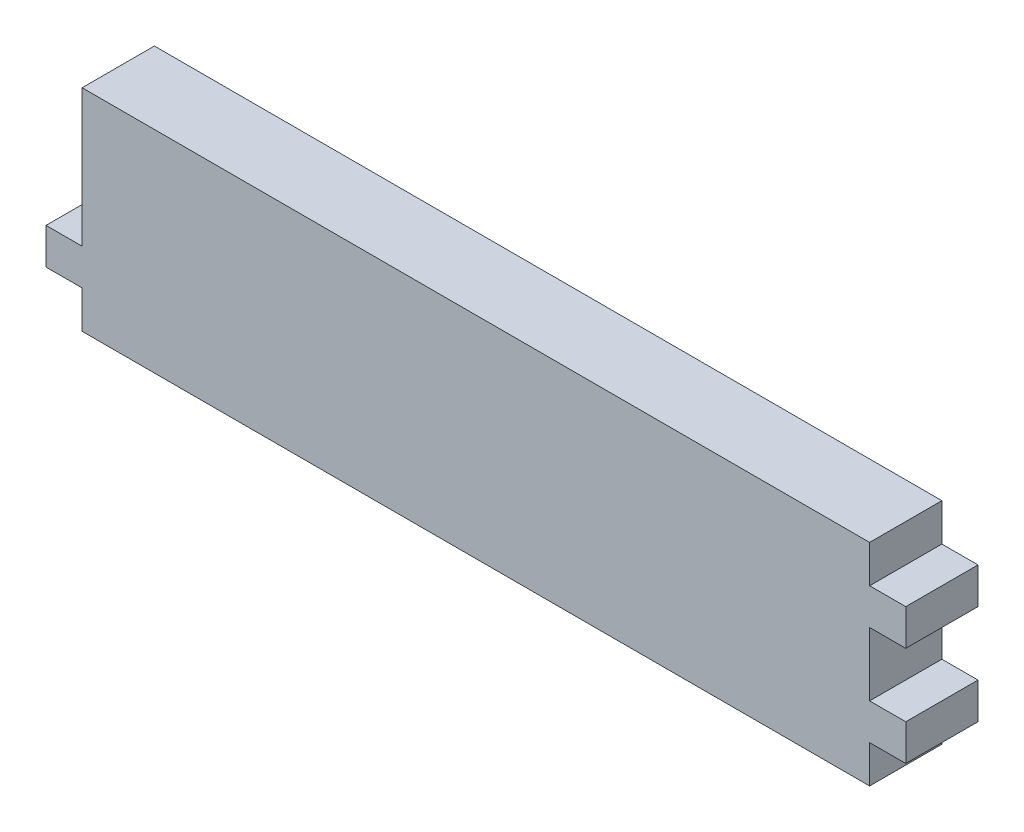
ISO-10303-21;
HEADER;
FILE_DESCRIPTION(('STEP AP214'),'2;1');
FILE_NAME('part.step','',(''),(''),'','','');
FILE_SCHEMA(('AUTOMOTIVE_DESIGN { 1 0 10303 214 1 1 1 1 }'));
ENDSEC;
DATA;
#1=APPLICATION_CONTEXT('core data for automotive mechanical design processes');
#2=APPLICATION_PROTOCOL_DEFINITION('international standard','automotive_design',2000,#1);
#3=PRODUCT_CONTEXT('',#1,'mechanical');
#4=PRODUCT('Part','Part','',(#3));
#5=PRODUCT_RELATED_PRODUCT_CATEGORY('part','',(#4));
#6=PRODUCT_DEFINITION_FORMATION('','',#4);
#7=PRODUCT_DEFINITION_CONTEXT('part definition',#1,'design');
#8=PRODUCT_DEFINITION('design','',#6,#7);
#9=PRODUCT_DEFINITION_SHAPE('','',#8);
#10=(LENGTH_UNIT() NAMED_UNIT(*) SI_UNIT(.MILLI.,.METRE.));
#11=(NAMED_UNIT(*) PLANE_ANGLE_UNIT() SI_UNIT($,.RADIAN.));
#12=(NAMED_UNIT(*) SI_UNIT($,.STERADIAN.) SOLID_ANGLE_UNIT());
#13=UNCERTAINTY_MEASURE_WITH_UNIT(LENGTH_MEASURE(1.E-05),#10,'distance_accuracy_value','');
#14=(GEOMETRIC_REPRESENTATION_CONTEXT(3) GLOBAL_UNCERTAINTY_ASSIGNED_CONTEXT((#13)) GLOBAL_UNIT_ASSIGNED_CONTEXT((#10,
#11,#12)) REPRESENTATION_CONTEXT('',''));
#15=CARTESIAN_POINT('',(0.,0.,0.));
#16=DIRECTION('',(0.,0.,1.));
#17=DIRECTION('',(1.,0.,0.));
#18=AXIS2_PLACEMENT_3D('',#15,#16,#17);
#19=CARTESIAN_POINT('',(208.864432811891,-6.78185633620085,84.1566513159383));
#20=DIRECTION('',(-1.,0.,0.));
#21=DIRECTION('',(0.,0.,1.));
#22=AXIS2_PLACEMENT_3D('',#19,#20,#21);
#23=PLANE('',#22);
#24=DIRECTION('',(0.,1.,0.));
#25=VECTOR('',#24,1.);
#26=CARTESIAN_POINT('',(208.864432811891,-6.78185633620085,6.35000000000001));
#27=LINE('',#26,#25);
#28=CARTESIAN_POINT('',(208.864432811891,-6.78185633620085,6.35000000000001));
#29=VERTEX_POINT('',#28);
#30=CARTESIAN_POINT('',(208.864432811891,-3.47985633620085,6.35000000000001));
#31=VERTEX_POINT('',#30);
#32=EDGE_CURVE('E203',#29,#31,#27,.T.);
#33=ORIENTED_EDGE('',*,*,#32,.F.);
#34=DIRECTION('',(0.,0.,-1.));
#35=VECTOR('',#34,1.);
#36=CARTESIAN_POINT('',(208.864432811891,-6.78185633620085,84.1566513159383));
#37=LINE('',#36,#35);
#38=CARTESIAN_POINT('',(208.864432811891,-6.78185633620085,0.));
#39=VERTEX_POINT('',#38);
#40=EDGE_CURVE('E36',#29,#39,#37,.T.);
#41=ORIENTED_EDGE('',*,*,#40,.T.);
#42=DIRECTION('',(0.,1.,0.));
#43=VECTOR('',#42,1.);
#44=CARTESIAN_POINT('',(208.864432811891,-6.78185633620085,0.));
#45=LINE('',#44,#43);
#46=CARTESIAN_POINT('',(208.864432811891,-3.47985633620085,0.));
#47=VERTEX_POINT('',#46);
#48=EDGE_CURVE('E211',#39,#47,#45,.T.);
#49=ORIENTED_EDGE('',*,*,#48,.T.);
#50=DIRECTION('',(0.,0.,-1.));
#51=VECTOR('',#50,1.);
#52=CARTESIAN_POINT('',(208.864432811891,-3.47985633620085,84.1566513159383));
#53=LINE('',#52,#51);
#54=EDGE_CURVE('E119',#31,#47,#53,.T.);
#55=ORIENTED_EDGE('',*,*,#54,.F.);
#56=EDGE_LOOP('',(#33,#41,#49,#55));
#57=FACE_BOUND('',#56,.T.);
#58=ADVANCED_FACE('F32',(#57),#23,.F.);
#59=CARTESIAN_POINT('',(208.864432811891,-3.47985633620085,84.1566513159383));
#60=DIRECTION('',(0.,1.,0.));
#61=DIRECTION('',(-1.,0.,0.));
#62=AXIS2_PLACEMENT_3D('',#59,#60,#61);
#63=PLANE('',#62);
#64=DIRECTION('',(1.,0.,0.));
#65=VECTOR('',#64,1.);
#66=CARTESIAN_POINT('',(208.864432811891,-3.47985633620085,6.35000000000001));
#67=LINE('',#66,#65);
#68=CARTESIAN_POINT('',(212.039432811891,-3.47985633620085,6.35000000000001));
#69=VERTEX_POINT('',#68);
#70=EDGE_CURVE('E126',#31,#69,#67,.T.);
#71=ORIENTED_EDGE('',*,*,#70,.F.);
#72=ORIENTED_EDGE('',*,*,#54,.T.);
#73=DIRECTION('',(1.,0.,0.));
#74=VECTOR('',#73,1.);
#75=CARTESIAN_POINT('',(208.864432811891,-3.47985633620085,0.));
#76=LINE('',#75,#74);
#77=CARTESIAN_POINT('',(212.039432811891,-3.47985633620085,0.));
#78=VERTEX_POINT('',#77);
#79=EDGE_CURVE('E210',#47,#78,#76,.T.);
#80=ORIENTED_EDGE('',*,*,#79,.T.);
#81=DIRECTION('',(0.,0.,-1.));
#82=VECTOR('',#81,1.);
#83=CARTESIAN_POINT('',(212.039432811891,-3.47985633620085,84.1566513159383));
#84=LINE('',#83,#82);
#85=EDGE_CURVE('E212',#69,#78,#84,.T.);
#86=ORIENTED_EDGE('',*,*,#85,.F.);
#87=EDGE_LOOP('',(#71,#72,#80,#86));
#88=FACE_BOUND('',#87,.T.);
#89=ADVANCED_FACE('F281',(#88),#63,.F.);
#90=CARTESIAN_POINT('',(212.039432811891,-0.304856336200848,84.1566513159383));
#91=DIRECTION('',(-1.,0.,0.));
#92=DIRECTION('',(0.,0.,1.));
#93=AXIS2_PLACEMENT_3D('',#90,#91,#92);
#94=PLANE('',#93);
#95=DIRECTION('',(0.,1.,0.));
#96=VECTOR('',#95,1.);
#97=CARTESIAN_POINT('',(212.039432811891,-0.304856336200848,6.35000000000001));
#98=LINE('',#97,#96);
#99=CARTESIAN_POINT('',(212.039432811891,-0.304856336200848,6.35000000000001));
#100=VERTEX_POINT('',#99);
#101=EDGE_CURVE('E199',#69,#100,#98,.T.);
#102=ORIENTED_EDGE('',*,*,#101,.F.);
#103=ORIENTED_EDGE('',*,*,#85,.T.);
#104=DIRECTION('',(0.,1.,0.));
#105=VECTOR('',#104,1.);
#106=CARTESIAN_POINT('',(212.039432811891,-0.304856336200848,0.));
#107=LINE('',#106,#105);
#108=CARTESIAN_POINT('',(212.039432811891,-0.304856336200848,0.));
#109=VERTEX_POINT('',#108);
#110=EDGE_CURVE('E214',#78,#109,#107,.T.);
#111=ORIENTED_EDGE('',*,*,#110,.T.);
#112=DIRECTION('',(0.,0.,-1.));
#113=VECTOR('',#112,1.);
#114=CARTESIAN_POINT('',(212.039432811891,-0.304856336200848,84.1566513159383));
#115=LINE('',#114,#113);
#116=EDGE_CURVE('E215',#100,#109,#115,.T.);
#117=ORIENTED_EDGE('',*,*,#116,.F.);
#118=EDGE_LOOP('',(#102,#103,#111,#117));
#119=FACE_BOUND('',#118,.T.);
#120=ADVANCED_FACE('F284',(#119),#94,.F.);
#121=CARTESIAN_POINT('',(212.039432811891,-0.304856336200848,84.1566513159383));
#122=DIRECTION('',(0.,-1.,0.));
#123=DIRECTION('',(1.,0.,0.));
#124=AXIS2_PLACEMENT_3D('',#121,#122,#123);
#125=PLANE('',#124);
#126=DIRECTION('',(-1.,0.,0.));
#127=VECTOR('',#126,1.);
#128=CARTESIAN_POINT('',(212.039432811891,-0.304856336200848,6.35000000000001));
#129=LINE('',#128,#127);
#130=CARTESIAN_POINT('',(208.864432811891,-0.304856336200846,6.35000000000001));
#131=VERTEX_POINT('',#130);
#132=EDGE_CURVE('E196',#100,#131,#129,.T.);
#133=ORIENTED_EDGE('',*,*,#132,.F.);
#134=ORIENTED_EDGE('',*,*,#116,.T.);
#135=DIRECTION('',(-1.,0.,0.));
#136=VECTOR('',#135,1.);
#137=CARTESIAN_POINT('',(212.039432811891,-0.304856336200848,0.));
#138=LINE('',#137,#136);
#139=CARTESIAN_POINT('',(208.864432811891,-0.304856336200846,0.));
#140=VERTEX_POINT('',#139);
#141=EDGE_CURVE('E217',#109,#140,#138,.T.);
#142=ORIENTED_EDGE('',*,*,#141,.T.);
#143=DIRECTION('',(0.,0.,-1.));
#144=VECTOR('',#143,1.);
#145=CARTESIAN_POINT('',(208.864432811891,-0.304856336200846,84.1566513159383));
#146=LINE('',#145,#144);
#147=EDGE_CURVE('E218',#131,#140,#146,.T.);
#148=ORIENTED_EDGE('',*,*,#147,.F.);
#149=EDGE_LOOP('',(#133,#134,#142,#148));
#150=FACE_BOUND('',#149,.T.);
#151=ADVANCED_FACE('F286',(#150),#125,.F.);
#152=CARTESIAN_POINT('',(208.864432811891,-0.304856336200846,84.1566513159383));
#153=DIRECTION('',(-1.,0.,0.));
#154=DIRECTION('',(0.,0.,1.));
#155=AXIS2_PLACEMENT_3D('',#152,#153,#154);
#156=PLANE('',#155);
#157=DIRECTION('',(0.,1.,0.));
#158=VECTOR('',#157,1.);
#159=CARTESIAN_POINT('',(208.864432811891,-0.304856336200846,6.35000000000001));
#160=LINE('',#159,#158);
#161=CARTESIAN_POINT('',(208.864432811891,5.28314366379915,6.35000000000001));
#162=VERTEX_POINT('',#161);
#163=EDGE_CURVE('E193',#131,#162,#160,.T.);
#164=ORIENTED_EDGE('',*,*,#163,.F.);
#165=ORIENTED_EDGE('',*,*,#147,.T.);
#166=DIRECTION('',(0.,1.,0.));
#167=VECTOR('',#166,1.);
#168=CARTESIAN_POINT('',(208.864432811891,-0.304856336200846,0.));
#169=LINE('',#168,#167);
#170=CARTESIAN_POINT('',(208.864432811891,5.28314366379915,0.));
#171=VERTEX_POINT('',#170);
#172=EDGE_CURVE('E220',#140,#171,#169,.T.);
#173=ORIENTED_EDGE('',*,*,#172,.T.);
#174=DIRECTION('',(0.,0.,-1.));
#175=VECTOR('',#174,1.);
#176=CARTESIAN_POINT('',(208.864432811891,5.28314366379915,84.1566513159383));
#177=LINE('',#176,#175);
#178=EDGE_CURVE('E221',#162,#171,#177,.T.);
#179=ORIENTED_EDGE('',*,*,#178,.F.);
#180=EDGE_LOOP('',(#164,#165,#173,#179));
#181=FACE_BOUND('',#180,.T.);
#182=ADVANCED_FACE('F290',(#181),#156,.F.);
#183=CARTESIAN_POINT('',(208.864432811891,5.28314366379915,84.1566513159383));
#184=DIRECTION('',(0.,1.,0.));
#185=DIRECTION('',(0.,0.,1.));
#186=AXIS2_PLACEMENT_3D('',#183,#184,#185);
#187=PLANE('',#186);
#188=DIRECTION('',(1.,0.,0.));
#189=VECTOR('',#188,1.);
#190=CARTESIAN_POINT('',(208.864432811891,5.28314366379915,6.35000000000001));
#191=LINE('',#190,#189);
#192=CARTESIAN_POINT('',(212.039432811891,5.28314366379915,6.35000000000001));
#193=VERTEX_POINT('',#192);
#194=EDGE_CURVE('E190',#162,#193,#191,.T.);
#195=ORIENTED_EDGE('',*,*,#194,.F.);
#196=ORIENTED_EDGE('',*,*,#178,.T.);
#197=DIRECTION('',(1.,0.,0.));
#198=VECTOR('',#197,1.);
#199=CARTESIAN_POINT('',(208.864432811891,5.28314366379915,0.));
#200=LINE('',#199,#198);
#201=CARTESIAN_POINT('',(212.039432811891,5.28314366379915,0.));
#202=VERTEX_POINT('',#201);
#203=EDGE_CURVE('E223',#171,#202,#200,.T.);
#204=ORIENTED_EDGE('',*,*,#203,.T.);
#205=DIRECTION('',(0.,0.,-1.));
#206=VECTOR('',#205,1.);
#207=CARTESIAN_POINT('',(212.039432811891,5.28314366379915,84.1566513159383));
#208=LINE('',#207,#206);
#209=EDGE_CURVE('E224',#193,#202,#208,.T.);
#210=ORIENTED_EDGE('',*,*,#209,.F.);
#211=EDGE_LOOP('',(#195,#196,#204,#210));
#212=FACE_BOUND('',#211,.T.);
#213=ADVANCED_FACE('F295',(#212),#187,.F.);
#214=CARTESIAN_POINT('',(212.039432811891,5.28314366379915,84.1566513159383));
#215=DIRECTION('',(-1.,0.,0.));
#216=DIRECTION('',(0.,0.,1.));
#217=AXIS2_PLACEMENT_3D('',#214,#215,#216);
#218=PLANE('',#217);
#219=DIRECTION('',(0.,1.,0.));
#220=VECTOR('',#219,1.);
#221=CARTESIAN_POINT('',(212.039432811891,5.28314366379915,6.35000000000001));
#222=LINE('',#221,#220);
#223=CARTESIAN_POINT('',(212.039432811891,8.45814366379914,6.35000000000001));
#224=VERTEX_POINT('',#223);
#225=EDGE_CURVE('E187',#193,#224,#222,.T.);
#226=ORIENTED_EDGE('',*,*,#225,.F.);
#227=ORIENTED_EDGE('',*,*,#209,.T.);
#228=DIRECTION('',(0.,1.,0.));
#229=VECTOR('',#228,1.);
#230=CARTESIAN_POINT('',(212.039432811891,5.28314366379915,0.));
#231=LINE('',#230,#229);
#232=CARTESIAN_POINT('',(212.039432811891,8.45814366379914,0.));
#233=VERTEX_POINT('',#232);
#234=EDGE_CURVE('E226',#202,#233,#231,.T.);
#235=ORIENTED_EDGE('',*,*,#234,.T.);
#236=DIRECTION('',(0.,0.,-1.));
#237=VECTOR('',#236,1.);
#238=CARTESIAN_POINT('',(212.039432811891,8.45814366379914,84.1566513159383));
#239=LINE('',#238,#237);
#240=EDGE_CURVE('E227',#224,#233,#239,.T.);
#241=ORIENTED_EDGE('',*,*,#240,.F.);
#242=EDGE_LOOP('',(#226,#227,#235,#241));
#243=FACE_BOUND('',#242,.T.);
#244=ADVANCED_FACE('F298',(#243),#218,.F.);
#245=CARTESIAN_POINT('',(212.039432811891,8.45814366379914,84.1566513159383));
#246=DIRECTION('',(0.,-1.,0.));
#247=DIRECTION('',(1.,0.,0.));
#248=AXIS2_PLACEMENT_3D('',#245,#246,#247);
#249=PLANE('',#248);
#250=DIRECTION('',(-1.,0.,0.));
#251=VECTOR('',#250,1.);
#252=CARTESIAN_POINT('',(212.039432811891,8.45814366379914,6.35000000000001));
#253=LINE('',#252,#251);
#254=CARTESIAN_POINT('',(208.864432811891,8.45814366379915,6.35000000000001));
#255=VERTEX_POINT('',#254);
#256=EDGE_CURVE('E184',#224,#255,#253,.T.);
#257=ORIENTED_EDGE('',*,*,#256,.F.);
#258=ORIENTED_EDGE('',*,*,#240,.T.);
#259=DIRECTION('',(-1.,0.,0.));
#260=VECTOR('',#259,1.);
#261=CARTESIAN_POINT('',(212.039432811891,8.45814366379914,0.));
#262=LINE('',#261,#260);
#263=CARTESIAN_POINT('',(208.864432811891,8.45814366379915,0.));
#264=VERTEX_POINT('',#263);
#265=EDGE_CURVE('E229',#233,#264,#262,.T.);
#266=ORIENTED_EDGE('',*,*,#265,.T.);
#267=DIRECTION('',(0.,0.,-1.));
#268=VECTOR('',#267,1.);
#269=CARTESIAN_POINT('',(208.864432811891,8.45814366379915,84.1566513159383));
#270=LINE('',#269,#268);
#271=EDGE_CURVE('E230',#255,#264,#270,.T.);
#272=ORIENTED_EDGE('',*,*,#271,.F.);
#273=EDGE_LOOP('',(#257,#258,#266,#272));
#274=FACE_BOUND('',#273,.T.);
#275=ADVANCED_FACE('F302',(#274),#249,.F.);
#276=CARTESIAN_POINT('',(208.864432811891,8.45814366379915,84.1566513159383));
#277=DIRECTION('',(-1.,0.,0.));
#278=DIRECTION('',(0.,0.,1.));
#279=AXIS2_PLACEMENT_3D('',#276,#277,#278);
#280=PLANE('',#279);
#281=DIRECTION('',(0.,1.,0.));
#282=VECTOR('',#281,1.);
#283=CARTESIAN_POINT('',(208.864432811891,8.45814366379915,6.35000000000001));
#284=LINE('',#283,#282);
#285=CARTESIAN_POINT('',(208.864432811891,11.7601436637992,6.35000000000001));
#286=VERTEX_POINT('',#285);
#287=EDGE_CURVE('E181',#255,#286,#284,.T.);
#288=ORIENTED_EDGE('',*,*,#287,.F.);
#289=ORIENTED_EDGE('',*,*,#271,.T.);
#290=DIRECTION('',(0.,1.,0.));
#291=VECTOR('',#290,1.);
#292=CARTESIAN_POINT('',(208.864432811891,8.45814366379915,0.));
#293=LINE('',#292,#291);
#294=CARTESIAN_POINT('',(208.864432811891,11.7601436637992,0.));
#295=VERTEX_POINT('',#294);
#296=EDGE_CURVE('E232',#264,#295,#293,.T.);
#297=ORIENTED_EDGE('',*,*,#296,.T.);
#298=DIRECTION('',(0.,0.,-1.));
#299=VECTOR('',#298,1.);
#300=CARTESIAN_POINT('',(208.864432811891,11.7601436637992,84.1566513159383));
#301=LINE('',#300,#299);
#302=EDGE_CURVE('E233',#286,#295,#301,.T.);
#303=ORIENTED_EDGE('',*,*,#302,.F.);
#304=EDGE_LOOP('',(#288,#289,#297,#303));
#305=FACE_BOUND('',#304,.T.);
#306=ADVANCED_FACE('F307',(#305),#280,.F.);
#307=CARTESIAN_POINT('',(139.649432811891,11.7601436637992,84.1566513159383));
#308=DIRECTION('',(0.,-1.,0.));
#309=DIRECTION('',(0.,0.,-1.));
#310=AXIS2_PLACEMENT_3D('',#307,#308,#309);
#311=PLANE('',#310);
#312=DIRECTION('',(-1.,0.,0.));
#313=VECTOR('',#312,1.);
#314=CARTESIAN_POINT('',(139.649432811891,11.7601436637992,6.35000000000001));
#315=LINE('',#314,#313);
#316=CARTESIAN_POINT('',(139.649432811891,11.7601436637992,6.35000000000001));
#317=VERTEX_POINT('',#316);
#318=EDGE_CURVE('E178',#286,#317,#315,.T.);
#319=ORIENTED_EDGE('',*,*,#318,.F.);
#320=ORIENTED_EDGE('',*,*,#302,.T.);
#321=DIRECTION('',(-1.,0.,0.));
#322=VECTOR('',#321,1.);
#323=CARTESIAN_POINT('',(139.649432811891,11.7601436637992,0.));
#324=LINE('',#323,#322);
#325=CARTESIAN_POINT('',(139.649432811891,11.7601436637992,0.));
#326=VERTEX_POINT('',#325);
#327=EDGE_CURVE('E235',#295,#326,#324,.T.);
#328=ORIENTED_EDGE('',*,*,#327,.T.);
#329=DIRECTION('',(0.,0.,-1.));
#330=VECTOR('',#329,1.);
#331=CARTESIAN_POINT('',(139.649432811891,11.7601436637992,84.1566513159383));
#332=LINE('',#331,#330);
#333=EDGE_CURVE('E236',#317,#326,#332,.T.);
#334=ORIENTED_EDGE('',*,*,#333,.F.);
#335=EDGE_LOOP('',(#319,#320,#328,#334));
#336=FACE_BOUND('',#335,.T.);
#337=ADVANCED_FACE('F310',(#336),#311,.F.);
#338=CARTESIAN_POINT('',(139.649432811891,-0.304856336200848,84.1566513159383));
#339=DIRECTION('',(1.,0.,0.));
#340=DIRECTION('',(0.,0.,-1.));
#341=AXIS2_PLACEMENT_3D('',#338,#339,#340);
#342=PLANE('',#341);
#343=DIRECTION('',(0.,-1.,0.));
#344=VECTOR('',#343,1.);
#345=CARTESIAN_POINT('',(139.649432811891,-0.304856336200848,6.35000000000001));
#346=LINE('',#345,#344);
#347=CARTESIAN_POINT('',(139.649432811891,-0.304856336200848,6.35000000000001));
#348=VERTEX_POINT('',#347);
#349=EDGE_CURVE('E175',#317,#348,#346,.T.);
#350=ORIENTED_EDGE('',*,*,#349,.F.);
#351=ORIENTED_EDGE('',*,*,#333,.T.);
#352=DIRECTION('',(0.,-1.,0.));
#353=VECTOR('',#352,1.);
#354=CARTESIAN_POINT('',(139.649432811891,-0.304856336200848,0.));
#355=LINE('',#354,#353);
#356=CARTESIAN_POINT('',(139.649432811891,-0.304856336200848,0.));
#357=VERTEX_POINT('',#356);
#358=EDGE_CURVE('E238',#326,#357,#355,.T.);
#359=ORIENTED_EDGE('',*,*,#358,.T.);
#360=DIRECTION('',(0.,0.,-1.));
#361=VECTOR('',#360,1.);
#362=CARTESIAN_POINT('',(139.649432811891,-0.304856336200848,84.1566513159383));
#363=LINE('',#362,#361);
#364=EDGE_CURVE('E239',#348,#357,#363,.T.);
#365=ORIENTED_EDGE('',*,*,#364,.F.);
#366=EDGE_LOOP('',(#350,#351,#359,#365));
#367=FACE_BOUND('',#366,.T.);
#368=ADVANCED_FACE('F314',(#367),#342,.F.);
#369=CARTESIAN_POINT('',(139.649432811891,-0.304856336200848,84.1566513159383));
#370=DIRECTION('',(0.,-1.,0.));
#371=DIRECTION('',(0.,0.,-1.));
#372=AXIS2_PLACEMENT_3D('',#369,#370,#371);
#373=PLANE('',#372);
#374=DIRECTION('',(-1.,0.,0.));
#375=VECTOR('',#374,1.);
#376=CARTESIAN_POINT('',(139.649432811891,-0.304856336200848,6.35000000000001));
#377=LINE('',#376,#375);
#378=CARTESIAN_POINT('',(136.474432811891,-0.304856336200848,6.35000000000001));
#379=VERTEX_POINT('',#378);
#380=EDGE_CURVE('E170',#348,#379,#377,.T.);
#381=ORIENTED_EDGE('',*,*,#380,.F.);
#382=ORIENTED_EDGE('',*,*,#364,.T.);
#383=DIRECTION('',(-1.,0.,0.));
#384=VECTOR('',#383,1.);
#385=CARTESIAN_POINT('',(139.649432811891,-0.304856336200848,0.));
#386=LINE('',#385,#384);
#387=CARTESIAN_POINT('',(136.474432811891,-0.304856336200848,0.));
#388=VERTEX_POINT('',#387);
#389=EDGE_CURVE('E241',#357,#388,#386,.T.);
#390=ORIENTED_EDGE('',*,*,#389,.T.);
#391=DIRECTION('',(0.,0.,-1.));
#392=VECTOR('',#391,1.);
#393=CARTESIAN_POINT('',(136.474432811891,-0.304856336200848,84.1566513159383));
#394=LINE('',#393,#392);
#395=EDGE_CURVE('E242',#379,#388,#394,.T.);
#396=ORIENTED_EDGE('',*,*,#395,.F.);
#397=EDGE_LOOP('',(#381,#382,#390,#396));
#398=FACE_BOUND('',#397,.T.);
#399=ADVANCED_FACE('F319',(#398),#373,.F.);
#400=CARTESIAN_POINT('',(136.474432811891,-0.304856336200848,84.1566513159383));
#401=DIRECTION('',(1.,0.,0.));
#402=DIRECTION('',(0.,0.,-1.));
#403=AXIS2_PLACEMENT_3D('',#400,#401,#402);
#404=PLANE('',#403);
#405=DIRECTION('',(0.,-1.,0.));
#406=VECTOR('',#405,1.);
#407=CARTESIAN_POINT('',(136.474432811891,-0.304856336200848,6.35000000000001));
#408=LINE('',#407,#406);
#409=CARTESIAN_POINT('',(136.474432811891,-3.47985633620085,6.35000000000001));
#410=VERTEX_POINT('',#409);
#411=EDGE_CURVE('E168',#379,#410,#408,.T.);
#412=ORIENTED_EDGE('',*,*,#411,.F.);
#413=ORIENTED_EDGE('',*,*,#395,.T.);
#414=DIRECTION('',(0.,-1.,0.));
#415=VECTOR('',#414,1.);
#416=CARTESIAN_POINT('',(136.474432811891,-0.304856336200848,0.));
#417=LINE('',#416,#415);
#418=CARTESIAN_POINT('',(136.474432811891,-3.47985633620085,0.));
#419=VERTEX_POINT('',#418);
#420=EDGE_CURVE('E244',#388,#419,#417,.T.);
#421=ORIENTED_EDGE('',*,*,#420,.T.);
#422=DIRECTION('',(0.,0.,-1.));
#423=VECTOR('',#422,1.);
#424=CARTESIAN_POINT('',(136.474432811891,-3.47985633620085,84.1566513159383));
#425=LINE('',#424,#423);
#426=EDGE_CURVE('E245',#410,#419,#425,.T.);
#427=ORIENTED_EDGE('',*,*,#426,.F.);
#428=EDGE_LOOP('',(#412,#413,#421,#427));
#429=FACE_BOUND('',#428,.T.);
#430=ADVANCED_FACE('F322',(#429),#404,.F.);
#431=CARTESIAN_POINT('',(136.474432811891,-3.47985633620085,84.1566513159383));
#432=DIRECTION('',(0.,1.,0.));
#433=DIRECTION('',(0.,0.,1.));
#434=AXIS2_PLACEMENT_3D('',#431,#432,#433);
#435=PLANE('',#434);
#436=DIRECTION('',(1.,0.,0.));
#437=VECTOR('',#436,1.);
#438=CARTESIAN_POINT('',(136.474432811891,-3.47985633620085,6.35000000000001));
#439=LINE('',#438,#437);
#440=CARTESIAN_POINT('',(139.649432811891,-3.47985633620085,6.35000000000001));
#441=VERTEX_POINT('',#440);
#442=EDGE_CURVE('E41',#410,#441,#439,.T.);
#443=ORIENTED_EDGE('',*,*,#442,.F.);
#444=ORIENTED_EDGE('',*,*,#426,.T.);
#445=DIRECTION('',(1.,0.,0.));
#446=VECTOR('',#445,1.);
#447=CARTESIAN_POINT('',(136.474432811891,-3.47985633620085,0.));
#448=LINE('',#447,#446);
#449=CARTESIAN_POINT('',(139.649432811891,-3.47985633620085,0.));
#450=VERTEX_POINT('',#449);
#451=EDGE_CURVE('E162',#419,#450,#448,.T.);
#452=ORIENTED_EDGE('',*,*,#451,.T.);
#453=DIRECTION('',(0.,0.,-1.));
#454=VECTOR('',#453,1.);
#455=CARTESIAN_POINT('',(139.649432811891,-3.47985633620085,84.1566513159383));
#456=LINE('',#455,#454);
#457=EDGE_CURVE('E153',#441,#450,#456,.T.);
#458=ORIENTED_EDGE('',*,*,#457,.F.);
#459=EDGE_LOOP('',(#443,#444,#452,#458));
#460=FACE_BOUND('',#459,.T.);
#461=ADVANCED_FACE('F159',(#460),#435,.F.);
#462=CARTESIAN_POINT('',(139.649432811891,-6.78185633620085,84.1566513159383));
#463=DIRECTION('',(1.,0.,0.));
#464=DIRECTION('',(0.,0.,-1.));
#465=AXIS2_PLACEMENT_3D('',#462,#463,#464);
#466=PLANE('',#465);
#467=DIRECTION('',(0.,-1.,0.));
#468=VECTOR('',#467,1.);
#469=CARTESIAN_POINT('',(139.649432811891,-6.78185633620085,6.35000000000001));
#470=LINE('',#469,#468);
#471=CARTESIAN_POINT('',(139.649432811891,-6.78185633620085,6.35000000000001));
#472=VERTEX_POINT('',#471);
#473=EDGE_CURVE('E11',#441,#472,#470,.T.);
#474=ORIENTED_EDGE('',*,*,#473,.F.);
#475=ORIENTED_EDGE('',*,*,#457,.T.);
#476=DIRECTION('',(0.,-1.,0.));
#477=VECTOR('',#476,1.);
#478=CARTESIAN_POINT('',(139.649432811891,-6.78185633620085,0.));
#479=LINE('',#478,#477);
#480=CARTESIAN_POINT('',(139.649432811891,-6.78185633620085,0.));
#481=VERTEX_POINT('',#480);
#482=EDGE_CURVE('E164',#450,#481,#479,.T.);
#483=ORIENTED_EDGE('',*,*,#482,.T.);
#484=DIRECTION('',(0.,0.,-1.));
#485=VECTOR('',#484,1.);
#486=CARTESIAN_POINT('',(139.649432811891,-6.78185633620085,84.1566513159383));
#487=LINE('',#486,#485);
#488=EDGE_CURVE('E54',#472,#481,#487,.T.);
#489=ORIENTED_EDGE('',*,*,#488,.F.);
#490=EDGE_LOOP('',(#474,#475,#483,#489));
#491=FACE_BOUND('',#490,.T.);
#492=ADVANCED_FACE('F152',(#491),#466,.F.);
#493=CARTESIAN_POINT('',(208.864432811891,-6.78185633620085,84.1566513159383));
#494=DIRECTION('',(0.,1.,0.));
#495=DIRECTION('',(0.,0.,1.));
#496=AXIS2_PLACEMENT_3D('',#493,#494,#495);
#497=PLANE('',#496);
#498=DIRECTION('',(1.,0.,0.));
#499=VECTOR('',#498,1.);
#500=CARTESIAN_POINT('',(208.864432811891,-6.78185633620085,6.35000000000001));
#501=LINE('',#500,#499);
#502=EDGE_CURVE('E206',#472,#29,#501,.T.);
#503=ORIENTED_EDGE('',*,*,#502,.F.);
#504=ORIENTED_EDGE('',*,*,#488,.T.);
#505=DIRECTION('',(1.,0.,0.));
#506=VECTOR('',#505,1.);
#507=CARTESIAN_POINT('',(208.864432811891,-6.78185633620085,0.));
#508=LINE('',#507,#506);
#509=EDGE_CURVE('E208',#481,#39,#508,.T.);
#510=ORIENTED_EDGE('',*,*,#509,.T.);
#511=ORIENTED_EDGE('',*,*,#40,.F.);
#512=EDGE_LOOP('',(#503,#504,#510,#511));
#513=FACE_BOUND('',#512,.T.);
#514=ADVANCED_FACE('F276',(#513),#497,.F.);
#515=CARTESIAN_POINT('',(0.,0.,0.));
#516=DIRECTION('',(0.,0.,-1.));
#517=DIRECTION('',(-1.,0.,0.));
#518=AXIS2_PLACEMENT_3D('',#515,#516,#517);
#519=PLANE('',#518);
#520=ORIENTED_EDGE('',*,*,#48,.F.);
#521=ORIENTED_EDGE('',*,*,#509,.F.);
#522=ORIENTED_EDGE('',*,*,#482,.F.);
#523=ORIENTED_EDGE('',*,*,#451,.F.);
#524=ORIENTED_EDGE('',*,*,#420,.F.);
#525=ORIENTED_EDGE('',*,*,#389,.F.);
#526=ORIENTED_EDGE('',*,*,#358,.F.);
#527=ORIENTED_EDGE('',*,*,#327,.F.);
#528=ORIENTED_EDGE('',*,*,#296,.F.);
#529=ORIENTED_EDGE('',*,*,#265,.F.);
#530=ORIENTED_EDGE('',*,*,#234,.F.);
#531=ORIENTED_EDGE('',*,*,#203,.F.);
#532=ORIENTED_EDGE('',*,*,#172,.F.);
#533=ORIENTED_EDGE('',*,*,#141,.F.);
#534=ORIENTED_EDGE('',*,*,#110,.F.);
#535=ORIENTED_EDGE('',*,*,#79,.F.);
#536=EDGE_LOOP('',(#520,#521,#522,#523,#524,#525,#526,#527,#528,#529,#530,#531,#532,#533,#534,#535));
#537=FACE_BOUND('',#536,.T.);
#538=ADVANCED_FACE('F278',(#537),#519,.T.);
#539=CARTESIAN_POINT('',(290.902241653907,-0.304856336200848,6.35000000000001));
#540=DIRECTION('',(0.,0.,1.));
#541=DIRECTION('',(1.,0.,0.));
#542=AXIS2_PLACEMENT_3D('',#539,#540,#541);
#543=PLANE('',#542);
#544=ORIENTED_EDGE('',*,*,#502,.T.);
#545=ORIENTED_EDGE('',*,*,#32,.T.);
#546=ORIENTED_EDGE('',*,*,#70,.T.);
#547=ORIENTED_EDGE('',*,*,#101,.T.);
#548=ORIENTED_EDGE('',*,*,#132,.T.);
#549=ORIENTED_EDGE('',*,*,#163,.T.);
#550=ORIENTED_EDGE('',*,*,#194,.T.);
#551=ORIENTED_EDGE('',*,*,#225,.T.);
#552=ORIENTED_EDGE('',*,*,#256,.T.);
#553=ORIENTED_EDGE('',*,*,#287,.T.);
#554=ORIENTED_EDGE('',*,*,#318,.T.);
#555=ORIENTED_EDGE('',*,*,#349,.T.);
#556=ORIENTED_EDGE('',*,*,#380,.T.);
#557=ORIENTED_EDGE('',*,*,#411,.T.);
#558=ORIENTED_EDGE('',*,*,#442,.T.);
#559=ORIENTED_EDGE('',*,*,#473,.T.);
#560=EDGE_LOOP('',(#544,#545,#546,#547,#548,#549,#550,#551,#552,#553,#554,#555,#556,#557,#558,#559));
#561=FACE_BOUND('',#560,.T.);
#562=ADVANCED_FACE('F34',(#561),#543,.T.);
#563=CLOSED_SHELL('',(#58,#89,#120,#151,#182,#213,#244,#275,#306,#337,#368,#399,#430,#461,#492,
#514,#538,#562));
#564=MANIFOLD_SOLID_BREP('B2',#563);
#565=ADVANCED_BREP_SHAPE_REPRESENTATION('',(#18,#564),#14);
#566=SHAPE_DEFINITION_REPRESENTATION(#9,#565);
ENDSEC;
END-ISO-10303-21;
